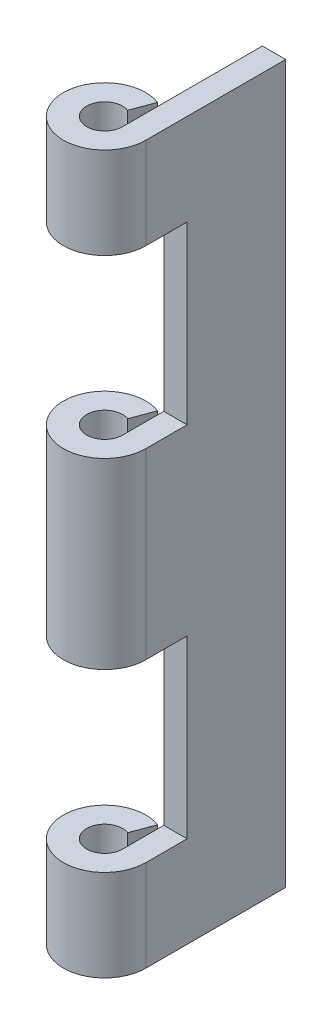
ISO-10303-21;
HEADER;
FILE_DESCRIPTION(('STEP AP214'),'2;1');
FILE_NAME('part.step','',(''),(''),'','','');
FILE_SCHEMA(('AUTOMOTIVE_DESIGN { 1 0 10303 214 1 1 1 1 }'));
ENDSEC;
DATA;
#1=APPLICATION_CONTEXT('core data for automotive mechanical design processes');
#2=APPLICATION_PROTOCOL_DEFINITION('international standard','automotive_design',2000,#1);
#3=PRODUCT_CONTEXT('',#1,'mechanical');
#4=PRODUCT('Part','Part','',(#3));
#5=PRODUCT_RELATED_PRODUCT_CATEGORY('part','',(#4));
#6=PRODUCT_DEFINITION_FORMATION('','',#4);
#7=PRODUCT_DEFINITION_CONTEXT('part definition',#1,'design');
#8=PRODUCT_DEFINITION('design','',#6,#7);
#9=PRODUCT_DEFINITION_SHAPE('','',#8);
#10=(LENGTH_UNIT() NAMED_UNIT(*) SI_UNIT(.MILLI.,.METRE.));
#11=(NAMED_UNIT(*) PLANE_ANGLE_UNIT() SI_UNIT($,.RADIAN.));
#12=(NAMED_UNIT(*) SI_UNIT($,.STERADIAN.) SOLID_ANGLE_UNIT());
#13=UNCERTAINTY_MEASURE_WITH_UNIT(LENGTH_MEASURE(1.E-05),#10,'distance_accuracy_value','');
#14=(GEOMETRIC_REPRESENTATION_CONTEXT(3) GLOBAL_UNCERTAINTY_ASSIGNED_CONTEXT((#13)) GLOBAL_UNIT_ASSIGNED_CONTEXT((#10,
#11,#12)) REPRESENTATION_CONTEXT('',''));
#15=CARTESIAN_POINT('',(0.,0.,0.));
#16=DIRECTION('',(0.,0.,1.));
#17=DIRECTION('',(1.,0.,0.));
#18=AXIS2_PLACEMENT_3D('',#15,#16,#17);
#19=CARTESIAN_POINT('',(-382.905,-366.905288474041,297.489389951088));
#20=DIRECTION('',(-0.937559071862967,0.,-0.347826086956472));
#21=DIRECTION('',(-0.347826086956472,0.,0.937559071862967));
#22=AXIS2_PLACEMENT_3D('',#19,#20,#21);
#23=PLANE('',#22);
#24=DIRECTION('',(0.,-1.,0.));
#25=VECTOR('',#24,1.);
#26=CARTESIAN_POINT('',(-382.905,-366.905288474041,297.489389951088));
#27=LINE('',#26,#25);
#28=CARTESIAN_POINT('',(-382.905,-399.923,297.489389951088));
#29=VERTEX_POINT('',#28);
#30=CARTESIAN_POINT('',(-382.905,-412.877,297.489389951088));
#31=VERTEX_POINT('',#30);
#32=EDGE_CURVE('E185',#29,#31,#27,.T.);
#33=ORIENTED_EDGE('',*,*,#32,.F.);
#34=DIRECTION('',(-0.347826086956472,0.,0.937559071862967));
#35=VECTOR('',#34,1.);
#36=CARTESIAN_POINT('',(-382.905,-399.923,297.489389951088));
#37=LINE('',#36,#35);
#38=CARTESIAN_POINT('',(-383.479260869565,-399.923,299.037299978734));
#39=VERTEX_POINT('',#38);
#40=EDGE_CURVE('E187',#39,#29,#37,.F.);
#41=ORIENTED_EDGE('',*,*,#40,.F.);
#42=DIRECTION('',(0.,-1.,0.));
#43=VECTOR('',#42,1.);
#44=CARTESIAN_POINT('',(-383.479260869565,-366.905288474041,299.037299978734));
#45=LINE('',#44,#43);
#46=CARTESIAN_POINT('',(-383.479260869565,-412.877,299.037299978734));
#47=VERTEX_POINT('',#46);
#48=EDGE_CURVE('E182',#39,#47,#45,.T.);
#49=ORIENTED_EDGE('',*,*,#48,.T.);
#50=DIRECTION('',(-0.347826086956472,0.,0.937559071862967));
#51=VECTOR('',#50,1.);
#52=CARTESIAN_POINT('',(-382.905,-412.877,297.489389951088));
#53=LINE('',#52,#51);
#54=EDGE_CURVE('E165',#31,#47,#53,.T.);
#55=ORIENTED_EDGE('',*,*,#54,.F.);
#56=EDGE_LOOP('',(#33,#41,#49,#55));
#57=FACE_BOUND('',#56,.T.);
#58=ADVANCED_FACE('F17',(#57),#23,.F.);
#59=CARTESIAN_POINT('',(-382.905,-366.905288474041,297.489389951088));
#60=DIRECTION('',(-0.937559071862967,0.,-0.347826086956472));
#61=DIRECTION('',(-0.347826086956472,0.,0.937559071862967));
#62=AXIS2_PLACEMENT_3D('',#59,#60,#61);
#63=PLANE('',#62);
#64=DIRECTION('',(0.,-1.,0.));
#65=VECTOR('',#64,1.);
#66=CARTESIAN_POINT('',(-382.905,-366.905288474041,297.489389951088));
#67=LINE('',#66,#65);
#68=CARTESIAN_POINT('',(-382.905,-381.,297.489389951088));
#69=VERTEX_POINT('',#68);
#70=CARTESIAN_POINT('',(-382.905,-387.477,297.489389951088));
#71=VERTEX_POINT('',#70);
#72=EDGE_CURVE('E164',#69,#71,#67,.T.);
#73=ORIENTED_EDGE('',*,*,#72,.F.);
#74=DIRECTION('',(-0.347826086956472,0.,0.937559071862967));
#75=VECTOR('',#74,1.);
#76=CARTESIAN_POINT('',(-382.905,-381.,297.489389951088));
#77=LINE('',#76,#75);
#78=CARTESIAN_POINT('',(-383.479260869565,-381.,299.037299978734));
#79=VERTEX_POINT('',#78);
#80=EDGE_CURVE('E149',#79,#69,#77,.F.);
#81=ORIENTED_EDGE('',*,*,#80,.F.);
#82=DIRECTION('',(0.,-1.,0.));
#83=VECTOR('',#82,1.);
#84=CARTESIAN_POINT('',(-383.479260869565,-366.905288474041,299.037299978734));
#85=LINE('',#84,#83);
#86=CARTESIAN_POINT('',(-383.479260869565,-387.477,299.037299978734));
#87=VERTEX_POINT('',#86);
#88=EDGE_CURVE('E161',#79,#87,#85,.T.);
#89=ORIENTED_EDGE('',*,*,#88,.T.);
#90=DIRECTION('',(0.347826086956472,0.,-0.937559071862967));
#91=VECTOR('',#90,1.);
#92=CARTESIAN_POINT('',(-383.479260869565,-387.477,299.037299978734));
#93=LINE('',#92,#91);
#94=EDGE_CURVE('E214',#87,#71,#93,.T.);
#95=ORIENTED_EDGE('',*,*,#94,.T.);
#96=EDGE_LOOP('',(#73,#81,#89,#95));
#97=FACE_BOUND('',#96,.T.);
#98=ADVANCED_FACE('F159',(#97),#63,.F.);
#99=CARTESIAN_POINT('',(-383.921,-366.905288474041,300.228));
#100=DIRECTION('',(0.,-1.,0.));
#101=DIRECTION('',(0.,0.,-1.));
#102=AXIS2_PLACEMENT_3D('',#99,#100,#101);
#103=CYLINDRICAL_SURFACE('',#102,1.26999999999996);
#104=CARTESIAN_POINT('',(-383.921,-387.477,300.228));
#105=DIRECTION('',(0.,-1.,0.));
#106=DIRECTION('',(0.,0.,-1.));
#107=AXIS2_PLACEMENT_3D('',#104,#105,#106);
#108=CIRCLE('',#107,1.26999999999996);
#109=CARTESIAN_POINT('',(-382.651,-387.477,300.228));
#110=VERTEX_POINT('',#109);
#111=EDGE_CURVE('E169',#110,#87,#108,.T.);
#112=ORIENTED_EDGE('',*,*,#111,.T.);
#113=ORIENTED_EDGE('',*,*,#88,.F.);
#114=CARTESIAN_POINT('',(-383.921,-381.,300.228));
#115=DIRECTION('',(0.,-1.,0.));
#116=DIRECTION('',(0.,0.,-1.));
#117=AXIS2_PLACEMENT_3D('',#114,#115,#116);
#118=CIRCLE('',#117,1.26999999999996);
#119=CARTESIAN_POINT('',(-382.651,-381.,300.228));
#120=VERTEX_POINT('',#119);
#121=EDGE_CURVE('E146',#120,#79,#118,.T.);
#122=ORIENTED_EDGE('',*,*,#121,.F.);
#123=DIRECTION('',(0.,1.,0.));
#124=VECTOR('',#123,1.);
#125=CARTESIAN_POINT('',(-382.651,-366.905288474041,300.228));
#126=LINE('',#125,#124);
#127=EDGE_CURVE('E232',#120,#110,#126,.F.);
#128=ORIENTED_EDGE('',*,*,#127,.T.);
#129=EDGE_LOOP('',(#112,#113,#122,#128));
#130=FACE_BOUND('',#129,.T.);
#131=ADVANCED_FACE('F168',(#130),#103,.F.);
#132=CARTESIAN_POINT('',(-382.905,-366.905288474041,297.489389951088));
#133=DIRECTION('',(-0.937559071862967,0.,-0.347826086956472));
#134=DIRECTION('',(-0.347826086956472,0.,0.937559071862967));
#135=AXIS2_PLACEMENT_3D('',#132,#133,#134);
#136=PLANE('',#135);
#137=DIRECTION('',(0.,-1.,0.));
#138=VECTOR('',#137,1.);
#139=CARTESIAN_POINT('',(-383.479260869565,-366.905288474041,299.037299978734));
#140=LINE('',#139,#138);
#141=CARTESIAN_POINT('',(-383.479260869565,-425.323,299.037299978734));
#142=VERTEX_POINT('',#141);
#143=CARTESIAN_POINT('',(-383.479260869565,-431.8,299.037299978734));
#144=VERTEX_POINT('',#143);
#145=EDGE_CURVE('E172',#142,#144,#140,.T.);
#146=ORIENTED_EDGE('',*,*,#145,.T.);
#147=DIRECTION('',(0.347826086956472,0.,-0.937559071862967));
#148=VECTOR('',#147,1.);
#149=CARTESIAN_POINT('',(-383.479260869565,-431.8,299.037299978734));
#150=LINE('',#149,#148);
#151=CARTESIAN_POINT('',(-382.905,-431.8,297.489389951088));
#152=VERTEX_POINT('',#151);
#153=EDGE_CURVE('E207',#144,#152,#150,.T.);
#154=ORIENTED_EDGE('',*,*,#153,.T.);
#155=DIRECTION('',(0.,-1.,0.));
#156=VECTOR('',#155,1.);
#157=CARTESIAN_POINT('',(-382.905,-366.905288474041,297.489389951088));
#158=LINE('',#157,#156);
#159=CARTESIAN_POINT('',(-382.905,-425.323,297.489389951088));
#160=VERTEX_POINT('',#159);
#161=EDGE_CURVE('E204',#160,#152,#158,.T.);
#162=ORIENTED_EDGE('',*,*,#161,.F.);
#163=DIRECTION('',(-0.347826086956472,0.,0.937559071862967));
#164=VECTOR('',#163,1.);
#165=CARTESIAN_POINT('',(-382.905,-425.323,297.489389951088));
#166=LINE('',#165,#164);
#167=EDGE_CURVE('E170',#142,#160,#166,.F.);
#168=ORIENTED_EDGE('',*,*,#167,.F.);
#169=EDGE_LOOP('',(#146,#154,#162,#168));
#170=FACE_BOUND('',#169,.T.);
#171=ADVANCED_FACE('F431',(#170),#136,.F.);
#172=CARTESIAN_POINT('',(-383.921,-366.905288474041,300.228));
#173=DIRECTION('',(0.,-1.,0.));
#174=DIRECTION('',(0.,0.,-1.));
#175=AXIS2_PLACEMENT_3D('',#172,#173,#174);
#176=CYLINDRICAL_SURFACE('',#175,1.26999999999996);
#177=DIRECTION('',(0.,1.,0.));
#178=VECTOR('',#177,1.);
#179=CARTESIAN_POINT('',(-382.651,-366.905288474041,300.228));
#180=LINE('',#179,#178);
#181=CARTESIAN_POINT('',(-382.651,-425.323,300.228));
#182=VERTEX_POINT('',#181);
#183=CARTESIAN_POINT('',(-382.651,-431.8,300.228));
#184=VERTEX_POINT('',#183);
#185=EDGE_CURVE('E238',#182,#184,#180,.F.);
#186=ORIENTED_EDGE('',*,*,#185,.T.);
#187=CARTESIAN_POINT('',(-383.921,-431.8,300.228));
#188=DIRECTION('',(0.,-1.,0.));
#189=DIRECTION('',(0.,0.,-1.));
#190=AXIS2_PLACEMENT_3D('',#187,#188,#189);
#191=CIRCLE('',#190,1.26999999999996);
#192=EDGE_CURVE('E205',#184,#144,#191,.T.);
#193=ORIENTED_EDGE('',*,*,#192,.T.);
#194=ORIENTED_EDGE('',*,*,#145,.F.);
#195=CARTESIAN_POINT('',(-383.921,-425.323,300.228));
#196=DIRECTION('',(0.,-1.,0.));
#197=DIRECTION('',(0.,0.,-1.));
#198=AXIS2_PLACEMENT_3D('',#195,#196,#197);
#199=CIRCLE('',#198,1.26999999999996);
#200=EDGE_CURVE('E195',#142,#182,#199,.F.);
#201=ORIENTED_EDGE('',*,*,#200,.T.);
#202=EDGE_LOOP('',(#186,#193,#194,#201));
#203=FACE_BOUND('',#202,.T.);
#204=ADVANCED_FACE('F363',(#203),#176,.F.);
#205=CARTESIAN_POINT('',(-382.651,-366.905288474041,290.322));
#206=DIRECTION('',(1.,0.,0.));
#207=DIRECTION('',(0.,0.,-1.));
#208=AXIS2_PLACEMENT_3D('',#205,#206,#207);
#209=PLANE('',#208);
#210=DIRECTION('',(0.,-1.,0.));
#211=VECTOR('',#210,1.);
#212=CARTESIAN_POINT('',(-382.651,-366.905288474041,300.228));
#213=LINE('',#212,#211);
#214=CARTESIAN_POINT('',(-382.651,-412.877,300.228));
#215=VERTEX_POINT('',#214);
#216=CARTESIAN_POINT('',(-382.651,-399.923,300.228));
#217=VERTEX_POINT('',#216);
#218=EDGE_CURVE('E186',#215,#217,#213,.F.);
#219=ORIENTED_EDGE('',*,*,#218,.T.);
#220=DIRECTION('',(0.,0.,-1.));
#221=VECTOR('',#220,1.);
#222=CARTESIAN_POINT('',(-382.651,-399.923,303.149));
#223=LINE('',#222,#221);
#224=CARTESIAN_POINT('',(-382.651,-399.923,297.307));
#225=VERTEX_POINT('',#224);
#226=EDGE_CURVE('E218',#217,#225,#223,.T.);
#227=ORIENTED_EDGE('',*,*,#226,.T.);
#228=DIRECTION('',(0.,1.,0.));
#229=VECTOR('',#228,1.);
#230=CARTESIAN_POINT('',(-382.651,-399.923,297.307));
#231=LINE('',#230,#229);
#232=CARTESIAN_POINT('',(-382.651,-387.477,297.307));
#233=VERTEX_POINT('',#232);
#234=EDGE_CURVE('E176',#225,#233,#231,.T.);
#235=ORIENTED_EDGE('',*,*,#234,.T.);
#236=DIRECTION('',(0.,0.,1.));
#237=VECTOR('',#236,1.);
#238=CARTESIAN_POINT('',(-382.651,-387.477,303.149));
#239=LINE('',#238,#237);
#240=EDGE_CURVE('E215',#233,#110,#239,.T.);
#241=ORIENTED_EDGE('',*,*,#240,.T.);
#242=ORIENTED_EDGE('',*,*,#127,.F.);
#243=DIRECTION('',(0.,0.,1.));
#244=VECTOR('',#243,1.);
#245=CARTESIAN_POINT('',(-382.651,-381.,300.228));
#246=LINE('',#245,#244);
#247=CARTESIAN_POINT('',(-382.651,-381.,290.322));
#248=VERTEX_POINT('',#247);
#249=EDGE_CURVE('E152',#248,#120,#246,.T.);
#250=ORIENTED_EDGE('',*,*,#249,.F.);
#251=DIRECTION('',(0.,1.,0.));
#252=VECTOR('',#251,1.);
#253=CARTESIAN_POINT('',(-382.651,-366.905288474041,290.322));
#254=LINE('',#253,#252);
#255=CARTESIAN_POINT('',(-382.651,-431.8,290.322));
#256=VERTEX_POINT('',#255);
#257=EDGE_CURVE('E244',#248,#256,#254,.F.);
#258=ORIENTED_EDGE('',*,*,#257,.T.);
#259=DIRECTION('',(0.,0.,1.));
#260=VECTOR('',#259,1.);
#261=CARTESIAN_POINT('',(-382.651,-431.8,300.228));
#262=LINE('',#261,#260);
#263=EDGE_CURVE('E208',#256,#184,#262,.T.);
#264=ORIENTED_EDGE('',*,*,#263,.T.);
#265=ORIENTED_EDGE('',*,*,#185,.F.);
#266=DIRECTION('',(0.,0.,-1.));
#267=VECTOR('',#266,1.);
#268=CARTESIAN_POINT('',(-382.651,-425.323,303.149));
#269=LINE('',#268,#267);
#270=CARTESIAN_POINT('',(-382.651,-425.323,297.307));
#271=VERTEX_POINT('',#270);
#272=EDGE_CURVE('E198',#182,#271,#269,.T.);
#273=ORIENTED_EDGE('',*,*,#272,.T.);
#274=DIRECTION('',(0.,1.,0.));
#275=VECTOR('',#274,1.);
#276=CARTESIAN_POINT('',(-382.651,-425.323,297.307));
#277=LINE('',#276,#275);
#278=CARTESIAN_POINT('',(-382.651,-412.877,297.307));
#279=VERTEX_POINT('',#278);
#280=EDGE_CURVE('E233',#271,#279,#277,.T.);
#281=ORIENTED_EDGE('',*,*,#280,.T.);
#282=DIRECTION('',(0.,0.,1.));
#283=VECTOR('',#282,1.);
#284=CARTESIAN_POINT('',(-382.651,-412.877,303.149));
#285=LINE('',#284,#283);
#286=EDGE_CURVE('E194',#279,#215,#285,.T.);
#287=ORIENTED_EDGE('',*,*,#286,.T.);
#288=EDGE_LOOP('',(#219,#227,#235,#241,#242,#250,#258,#264,#265,#273,#281,#287));
#289=FACE_BOUND('',#288,.T.);
#290=ADVANCED_FACE('F357',(#289),#209,.F.);
#291=CARTESIAN_POINT('',(-383.921,-366.905288474041,300.228));
#292=DIRECTION('',(0.,-1.,0.));
#293=DIRECTION('',(0.,0.,-1.));
#294=AXIS2_PLACEMENT_3D('',#291,#292,#293);
#295=CYLINDRICAL_SURFACE('',#294,1.26999999999996);
#296=CARTESIAN_POINT('',(-383.921,-412.877,300.228));
#297=DIRECTION('',(0.,-1.,0.));
#298=DIRECTION('',(0.,0.,-1.));
#299=AXIS2_PLACEMENT_3D('',#296,#297,#298);
#300=CIRCLE('',#299,1.26999999999996);
#301=EDGE_CURVE('E139',#215,#47,#300,.T.);
#302=ORIENTED_EDGE('',*,*,#301,.T.);
#303=ORIENTED_EDGE('',*,*,#48,.F.);
#304=CARTESIAN_POINT('',(-383.921,-399.923,300.228));
#305=DIRECTION('',(0.,-1.,0.));
#306=DIRECTION('',(0.,0.,-1.));
#307=AXIS2_PLACEMENT_3D('',#304,#305,#306);
#308=CIRCLE('',#307,1.26999999999996);
#309=EDGE_CURVE('E216',#39,#217,#308,.F.);
#310=ORIENTED_EDGE('',*,*,#309,.T.);
#311=ORIENTED_EDGE('',*,*,#218,.F.);
#312=EDGE_LOOP('',(#302,#303,#310,#311));
#313=FACE_BOUND('',#312,.T.);
#314=ADVANCED_FACE('F377',(#313),#295,.F.);
#315=CARTESIAN_POINT('',(-383.921,-366.905288474041,300.228));
#316=DIRECTION('',(0.,-1.,0.));
#317=DIRECTION('',(0.,0.,-1.));
#318=AXIS2_PLACEMENT_3D('',#315,#316,#317);
#319=CYLINDRICAL_SURFACE('',#318,2.92099999999996);
#320=CARTESIAN_POINT('',(-383.921,-399.923,300.228));
#321=DIRECTION('',(0.,-1.,0.));
#322=DIRECTION('',(0.,0.,-1.));
#323=AXIS2_PLACEMENT_3D('',#320,#321,#322);
#324=CIRCLE('',#323,2.92099999999996);
#325=CARTESIAN_POINT('',(-381.,-399.923,300.228));
#326=VERTEX_POINT('',#325);
#327=EDGE_CURVE('E20',#326,#29,#324,.T.);
#328=ORIENTED_EDGE('',*,*,#327,.T.);
#329=ORIENTED_EDGE('',*,*,#32,.T.);
#330=CARTESIAN_POINT('',(-383.921,-412.877,300.228));
#331=DIRECTION('',(0.,-1.,0.));
#332=DIRECTION('',(0.,0.,-1.));
#333=AXIS2_PLACEMENT_3D('',#330,#331,#332);
#334=CIRCLE('',#333,2.92099999999996);
#335=CARTESIAN_POINT('',(-381.,-412.877,300.228));
#336=VERTEX_POINT('',#335);
#337=EDGE_CURVE('E190',#31,#336,#334,.F.);
#338=ORIENTED_EDGE('',*,*,#337,.T.);
#339=DIRECTION('',(0.,1.,0.));
#340=VECTOR('',#339,1.);
#341=CARTESIAN_POINT('',(-381.,-366.905288474041,300.228));
#342=LINE('',#341,#340);
#343=EDGE_CURVE('E192',#336,#326,#342,.T.);
#344=ORIENTED_EDGE('',*,*,#343,.T.);
#345=EDGE_LOOP('',(#328,#329,#338,#344));
#346=FACE_BOUND('',#345,.T.);
#347=ADVANCED_FACE('F374',(#346),#319,.T.);
#348=CARTESIAN_POINT('',(-386.842,-399.923,303.149));
#349=DIRECTION('',(0.,-1.,0.));
#350=DIRECTION('',(0.,0.,-1.));
#351=AXIS2_PLACEMENT_3D('',#348,#349,#350);
#352=PLANE('',#351);
#353=ORIENTED_EDGE('',*,*,#309,.F.);
#354=ORIENTED_EDGE('',*,*,#40,.T.);
#355=ORIENTED_EDGE('',*,*,#327,.F.);
#356=DIRECTION('',(0.,0.,1.));
#357=VECTOR('',#356,1.);
#358=CARTESIAN_POINT('',(-381.,-399.923,300.228));
#359=LINE('',#358,#357);
#360=CARTESIAN_POINT('',(-381.,-399.923,297.307));
#361=VERTEX_POINT('',#360);
#362=EDGE_CURVE('E295',#326,#361,#359,.F.);
#363=ORIENTED_EDGE('',*,*,#362,.T.);
#364=DIRECTION('',(-1.,0.,0.));
#365=VECTOR('',#364,1.);
#366=CARTESIAN_POINT('',(-386.842,-399.923,297.307));
#367=LINE('',#366,#365);
#368=EDGE_CURVE('E179',#361,#225,#367,.T.);
#369=ORIENTED_EDGE('',*,*,#368,.T.);
#370=ORIENTED_EDGE('',*,*,#226,.F.);
#371=EDGE_LOOP('',(#353,#354,#355,#363,#369,#370));
#372=FACE_BOUND('',#371,.T.);
#373=ADVANCED_FACE('F376',(#372),#352,.F.);
#374=CARTESIAN_POINT('',(-386.842,-399.923,297.307));
#375=DIRECTION('',(0.,0.,-1.));
#376=DIRECTION('',(-1.,0.,0.));
#377=AXIS2_PLACEMENT_3D('',#374,#375,#376);
#378=PLANE('',#377);
#379=ORIENTED_EDGE('',*,*,#368,.F.);
#380=DIRECTION('',(0.,1.,0.));
#381=VECTOR('',#380,1.);
#382=CARTESIAN_POINT('',(-381.,-366.905288474041,297.307));
#383=LINE('',#382,#381);
#384=CARTESIAN_POINT('',(-381.,-387.477,297.307));
#385=VERTEX_POINT('',#384);
#386=EDGE_CURVE('E281',#361,#385,#383,.T.);
#387=ORIENTED_EDGE('',*,*,#386,.T.);
#388=DIRECTION('',(1.,0.,0.));
#389=VECTOR('',#388,1.);
#390=CARTESIAN_POINT('',(-386.842,-387.477,297.307));
#391=LINE('',#390,#389);
#392=EDGE_CURVE('E178',#385,#233,#391,.F.);
#393=ORIENTED_EDGE('',*,*,#392,.T.);
#394=ORIENTED_EDGE('',*,*,#234,.F.);
#395=EDGE_LOOP('',(#379,#387,#393,#394));
#396=FACE_BOUND('',#395,.T.);
#397=ADVANCED_FACE('F384',(#396),#378,.F.);
#398=CARTESIAN_POINT('',(-386.842,-387.477,303.149));
#399=DIRECTION('',(0.,1.,0.));
#400=DIRECTION('',(0.,0.,1.));
#401=AXIS2_PLACEMENT_3D('',#398,#399,#400);
#402=PLANE('',#401);
#403=ORIENTED_EDGE('',*,*,#94,.F.);
#404=ORIENTED_EDGE('',*,*,#111,.F.);
#405=ORIENTED_EDGE('',*,*,#240,.F.);
#406=ORIENTED_EDGE('',*,*,#392,.F.);
#407=DIRECTION('',(0.,0.,1.));
#408=VECTOR('',#407,1.);
#409=CARTESIAN_POINT('',(-381.,-387.477,300.228));
#410=LINE('',#409,#408);
#411=CARTESIAN_POINT('',(-381.,-387.477,300.228));
#412=VERTEX_POINT('',#411);
#413=EDGE_CURVE('E269',#385,#412,#410,.T.);
#414=ORIENTED_EDGE('',*,*,#413,.T.);
#415=CARTESIAN_POINT('',(-383.921,-387.477,300.228));
#416=DIRECTION('',(0.,-1.,0.));
#417=DIRECTION('',(0.,0.,-1.));
#418=AXIS2_PLACEMENT_3D('',#415,#416,#417);
#419=CIRCLE('',#418,2.92099999999996);
#420=EDGE_CURVE('E212',#71,#412,#419,.F.);
#421=ORIENTED_EDGE('',*,*,#420,.F.);
#422=EDGE_LOOP('',(#403,#404,#405,#406,#414,#421));
#423=FACE_BOUND('',#422,.T.);
#424=ADVANCED_FACE('F410',(#423),#402,.F.);
#425=CARTESIAN_POINT('',(-383.921,-366.905288474041,300.228));
#426=DIRECTION('',(0.,-1.,0.));
#427=DIRECTION('',(0.,0.,-1.));
#428=AXIS2_PLACEMENT_3D('',#425,#426,#427);
#429=CYLINDRICAL_SURFACE('',#428,2.92099999999996);
#430=CARTESIAN_POINT('',(-383.921,-381.,300.228));
#431=DIRECTION('',(0.,-1.,0.));
#432=DIRECTION('',(0.,0.,-1.));
#433=AXIS2_PLACEMENT_3D('',#430,#431,#432);
#434=CIRCLE('',#433,2.92099999999996);
#435=CARTESIAN_POINT('',(-381.,-381.,300.228));
#436=VERTEX_POINT('',#435);
#437=EDGE_CURVE('E210',#69,#436,#434,.F.);
#438=ORIENTED_EDGE('',*,*,#437,.F.);
#439=ORIENTED_EDGE('',*,*,#72,.T.);
#440=ORIENTED_EDGE('',*,*,#420,.T.);
#441=DIRECTION('',(0.,1.,0.));
#442=VECTOR('',#441,1.);
#443=CARTESIAN_POINT('',(-381.,-366.905288474041,300.228));
#444=LINE('',#443,#442);
#445=EDGE_CURVE('E253',#412,#436,#444,.T.);
#446=ORIENTED_EDGE('',*,*,#445,.T.);
#447=EDGE_LOOP('',(#438,#439,#440,#446));
#448=FACE_BOUND('',#447,.T.);
#449=ADVANCED_FACE('F250',(#448),#429,.T.);
#450=CARTESIAN_POINT('',(-383.921,-381.,300.228));
#451=DIRECTION('',(0.,1.,0.));
#452=DIRECTION('',(0.,0.,1.));
#453=AXIS2_PLACEMENT_3D('',#450,#451,#452);
#454=PLANE('',#453);
#455=ORIENTED_EDGE('',*,*,#121,.T.);
#456=ORIENTED_EDGE('',*,*,#80,.T.);
#457=ORIENTED_EDGE('',*,*,#437,.T.);
#458=DIRECTION('',(0.,0.,1.));
#459=VECTOR('',#458,1.);
#460=CARTESIAN_POINT('',(-381.,-381.,300.228));
#461=LINE('',#460,#459);
#462=CARTESIAN_POINT('',(-381.,-381.,290.322));
#463=VERTEX_POINT('',#462);
#464=EDGE_CURVE('E256',#436,#463,#461,.F.);
#465=ORIENTED_EDGE('',*,*,#464,.T.);
#466=DIRECTION('',(1.,0.,0.));
#467=VECTOR('',#466,1.);
#468=CARTESIAN_POINT('',(-381.,-381.,290.322));
#469=LINE('',#468,#467);
#470=EDGE_CURVE('E156',#463,#248,#469,.F.);
#471=ORIENTED_EDGE('',*,*,#470,.T.);
#472=ORIENTED_EDGE('',*,*,#249,.T.);
#473=EDGE_LOOP('',(#455,#456,#457,#465,#471,#472));
#474=FACE_BOUND('',#473,.T.);
#475=ADVANCED_FACE('F148',(#474),#454,.T.);
#476=CARTESIAN_POINT('',(-381.,-366.905288474041,290.322));
#477=DIRECTION('',(0.,0.,1.));
#478=DIRECTION('',(1.,0.,0.));
#479=AXIS2_PLACEMENT_3D('',#476,#477,#478);
#480=PLANE('',#479);
#481=DIRECTION('',(1.,0.,0.));
#482=VECTOR('',#481,1.);
#483=CARTESIAN_POINT('',(-383.921,-431.8,290.322));
#484=LINE('',#483,#482);
#485=CARTESIAN_POINT('',(-381.,-431.8,290.322));
#486=VERTEX_POINT('',#485);
#487=EDGE_CURVE('E246',#486,#256,#484,.F.);
#488=ORIENTED_EDGE('',*,*,#487,.T.);
#489=ORIENTED_EDGE('',*,*,#257,.F.);
#490=ORIENTED_EDGE('',*,*,#470,.F.);
#491=DIRECTION('',(0.,1.,0.));
#492=VECTOR('',#491,1.);
#493=CARTESIAN_POINT('',(-381.,-366.905288474041,290.322));
#494=LINE('',#493,#492);
#495=EDGE_CURVE('E265',#463,#486,#494,.F.);
#496=ORIENTED_EDGE('',*,*,#495,.T.);
#497=EDGE_LOOP('',(#488,#489,#490,#496));
#498=FACE_BOUND('',#497,.T.);
#499=ADVANCED_FACE('F354',(#498),#480,.F.);
#500=CARTESIAN_POINT('',(-383.921,-431.8,300.228));
#501=DIRECTION('',(0.,1.,0.));
#502=DIRECTION('',(0.,0.,1.));
#503=AXIS2_PLACEMENT_3D('',#500,#501,#502);
#504=PLANE('',#503);
#505=ORIENTED_EDGE('',*,*,#153,.F.);
#506=ORIENTED_EDGE('',*,*,#192,.F.);
#507=ORIENTED_EDGE('',*,*,#263,.F.);
#508=ORIENTED_EDGE('',*,*,#487,.F.);
#509=DIRECTION('',(0.,0.,1.));
#510=VECTOR('',#509,1.);
#511=CARTESIAN_POINT('',(-381.,-431.8,300.228));
#512=LINE('',#511,#510);
#513=CARTESIAN_POINT('',(-381.,-431.8,300.228));
#514=VERTEX_POINT('',#513);
#515=EDGE_CURVE('E267',#486,#514,#512,.T.);
#516=ORIENTED_EDGE('',*,*,#515,.T.);
#517=CARTESIAN_POINT('',(-383.921,-431.8,300.228));
#518=DIRECTION('',(0.,-1.,0.));
#519=DIRECTION('',(0.,0.,-1.));
#520=AXIS2_PLACEMENT_3D('',#517,#518,#519);
#521=CIRCLE('',#520,2.92099999999996);
#522=EDGE_CURVE('E202',#152,#514,#521,.F.);
#523=ORIENTED_EDGE('',*,*,#522,.F.);
#524=EDGE_LOOP('',(#505,#506,#507,#508,#516,#523));
#525=FACE_BOUND('',#524,.T.);
#526=ADVANCED_FACE('F360',(#525),#504,.F.);
#527=CARTESIAN_POINT('',(-383.921,-366.905288474041,300.228));
#528=DIRECTION('',(0.,-1.,0.));
#529=DIRECTION('',(0.,0.,-1.));
#530=AXIS2_PLACEMENT_3D('',#527,#528,#529);
#531=CYLINDRICAL_SURFACE('',#530,2.92099999999996);
#532=ORIENTED_EDGE('',*,*,#522,.T.);
#533=DIRECTION('',(0.,1.,0.));
#534=VECTOR('',#533,1.);
#535=CARTESIAN_POINT('',(-381.,-366.905288474041,300.228));
#536=LINE('',#535,#534);
#537=CARTESIAN_POINT('',(-381.,-425.323,300.228));
#538=VERTEX_POINT('',#537);
#539=EDGE_CURVE('E329',#514,#538,#536,.T.);
#540=ORIENTED_EDGE('',*,*,#539,.T.);
#541=CARTESIAN_POINT('',(-383.921,-425.323,300.228));
#542=DIRECTION('',(0.,-1.,0.));
#543=DIRECTION('',(0.,0.,-1.));
#544=AXIS2_PLACEMENT_3D('',#541,#542,#543);
#545=CIRCLE('',#544,2.92099999999996);
#546=EDGE_CURVE('E199',#538,#160,#545,.T.);
#547=ORIENTED_EDGE('',*,*,#546,.T.);
#548=ORIENTED_EDGE('',*,*,#161,.T.);
#549=EDGE_LOOP('',(#532,#540,#547,#548));
#550=FACE_BOUND('',#549,.T.);
#551=ADVANCED_FACE('F398',(#550),#531,.T.);
#552=CARTESIAN_POINT('',(-386.842,-425.323,303.149));
#553=DIRECTION('',(0.,-1.,0.));
#554=DIRECTION('',(0.,0.,-1.));
#555=AXIS2_PLACEMENT_3D('',#552,#553,#554);
#556=PLANE('',#555);
#557=ORIENTED_EDGE('',*,*,#200,.F.);
#558=ORIENTED_EDGE('',*,*,#167,.T.);
#559=ORIENTED_EDGE('',*,*,#546,.F.);
#560=DIRECTION('',(0.,0.,1.));
#561=VECTOR('',#560,1.);
#562=CARTESIAN_POINT('',(-381.,-425.323,300.228));
#563=LINE('',#562,#561);
#564=CARTESIAN_POINT('',(-381.,-425.323,297.307));
#565=VERTEX_POINT('',#564);
#566=EDGE_CURVE('E320',#538,#565,#563,.F.);
#567=ORIENTED_EDGE('',*,*,#566,.T.);
#568=DIRECTION('',(-1.,0.,0.));
#569=VECTOR('',#568,1.);
#570=CARTESIAN_POINT('',(-386.842,-425.323,297.307));
#571=LINE('',#570,#569);
#572=EDGE_CURVE('E235',#565,#271,#571,.T.);
#573=ORIENTED_EDGE('',*,*,#572,.T.);
#574=ORIENTED_EDGE('',*,*,#272,.F.);
#575=EDGE_LOOP('',(#557,#558,#559,#567,#573,#574));
#576=FACE_BOUND('',#575,.T.);
#577=ADVANCED_FACE('F368',(#576),#556,.F.);
#578=CARTESIAN_POINT('',(-386.842,-425.323,297.307));
#579=DIRECTION('',(0.,0.,-1.));
#580=DIRECTION('',(-1.,0.,0.));
#581=AXIS2_PLACEMENT_3D('',#578,#579,#580);
#582=PLANE('',#581);
#583=ORIENTED_EDGE('',*,*,#572,.F.);
#584=DIRECTION('',(0.,1.,0.));
#585=VECTOR('',#584,1.);
#586=CARTESIAN_POINT('',(-381.,-366.905288474041,297.307));
#587=LINE('',#586,#585);
#588=CARTESIAN_POINT('',(-381.,-412.877,297.307));
#589=VERTEX_POINT('',#588);
#590=EDGE_CURVE('E26',#565,#589,#587,.T.);
#591=ORIENTED_EDGE('',*,*,#590,.T.);
#592=DIRECTION('',(1.,0.,0.));
#593=VECTOR('',#592,1.);
#594=CARTESIAN_POINT('',(-386.842,-412.877,297.307));
#595=LINE('',#594,#593);
#596=EDGE_CURVE('E34',#589,#279,#595,.F.);
#597=ORIENTED_EDGE('',*,*,#596,.T.);
#598=ORIENTED_EDGE('',*,*,#280,.F.);
#599=EDGE_LOOP('',(#583,#591,#597,#598));
#600=FACE_BOUND('',#599,.T.);
#601=ADVANCED_FACE('F371',(#600),#582,.F.);
#602=CARTESIAN_POINT('',(-386.842,-412.877,303.149));
#603=DIRECTION('',(0.,1.,0.));
#604=DIRECTION('',(0.,0.,1.));
#605=AXIS2_PLACEMENT_3D('',#602,#603,#604);
#606=PLANE('',#605);
#607=ORIENTED_EDGE('',*,*,#54,.T.);
#608=ORIENTED_EDGE('',*,*,#301,.F.);
#609=ORIENTED_EDGE('',*,*,#286,.F.);
#610=ORIENTED_EDGE('',*,*,#596,.F.);
#611=DIRECTION('',(0.,0.,1.));
#612=VECTOR('',#611,1.);
#613=CARTESIAN_POINT('',(-381.,-412.877,300.228));
#614=LINE('',#613,#612);
#615=EDGE_CURVE('E11',#589,#336,#614,.T.);
#616=ORIENTED_EDGE('',*,*,#615,.T.);
#617=ORIENTED_EDGE('',*,*,#337,.F.);
#618=EDGE_LOOP('',(#607,#608,#609,#610,#616,#617));
#619=FACE_BOUND('',#618,.T.);
#620=ADVANCED_FACE('F373',(#619),#606,.F.);
#621=CARTESIAN_POINT('',(-381.,-366.905288474041,300.228));
#622=DIRECTION('',(-1.,0.,0.));
#623=DIRECTION('',(0.,0.,1.));
#624=AXIS2_PLACEMENT_3D('',#621,#622,#623);
#625=PLANE('',#624);
#626=ORIENTED_EDGE('',*,*,#590,.F.);
#627=ORIENTED_EDGE('',*,*,#566,.F.);
#628=ORIENTED_EDGE('',*,*,#539,.F.);
#629=ORIENTED_EDGE('',*,*,#515,.F.);
#630=ORIENTED_EDGE('',*,*,#495,.F.);
#631=ORIENTED_EDGE('',*,*,#464,.F.);
#632=ORIENTED_EDGE('',*,*,#445,.F.);
#633=ORIENTED_EDGE('',*,*,#413,.F.);
#634=ORIENTED_EDGE('',*,*,#386,.F.);
#635=ORIENTED_EDGE('',*,*,#362,.F.);
#636=ORIENTED_EDGE('',*,*,#343,.F.);
#637=ORIENTED_EDGE('',*,*,#615,.F.);
#638=EDGE_LOOP('',(#626,#627,#628,#629,#630,#631,#632,#633,#634,#635,#636,#637));
#639=FACE_BOUND('',#638,.T.);
#640=ADVANCED_FACE('F260',(#639),#625,.F.);
#641=CLOSED_SHELL('',(#58,#98,#131,#171,#204,#290,#314,#347,#373,#397,#424,#449,#475,#499,#526,
#551,#577,#601,#620,#640));
#642=MANIFOLD_SOLID_BREP('B1',#641);
#643=ADVANCED_BREP_SHAPE_REPRESENTATION('',(#18,#642),#14);
#644=SHAPE_DEFINITION_REPRESENTATION(#9,#643);
ENDSEC;
END-ISO-10303-21;
